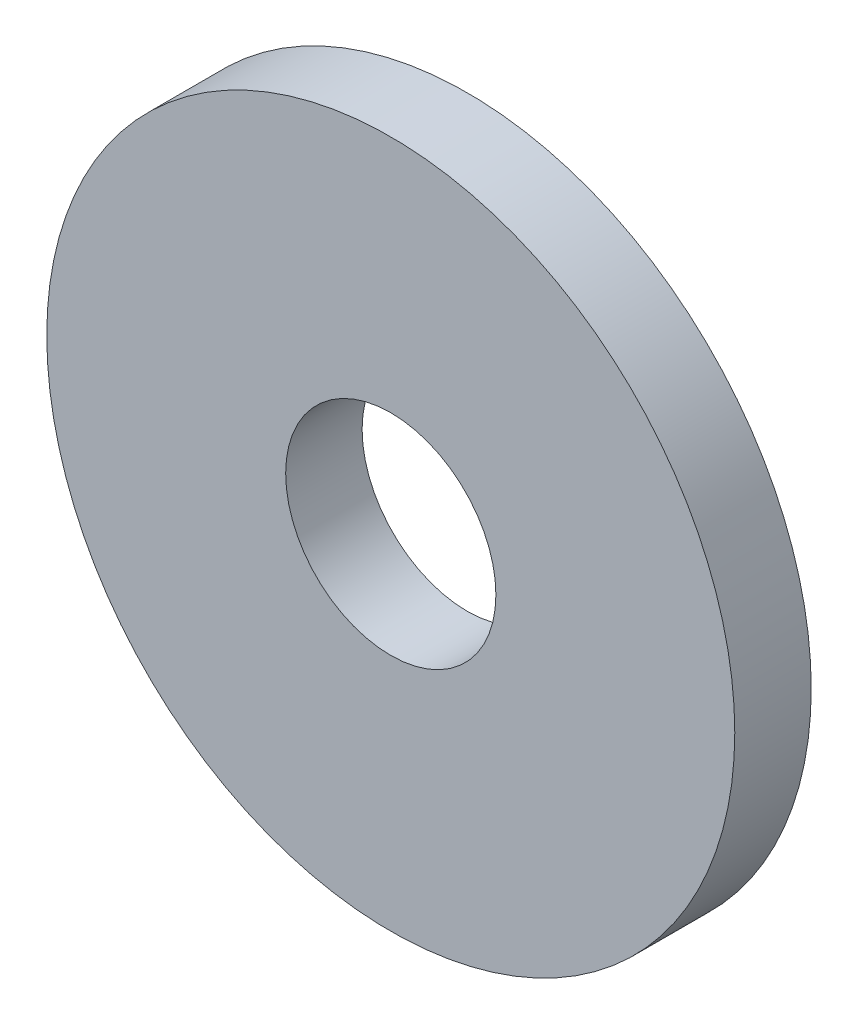
ISO-10303-21;
HEADER;
FILE_DESCRIPTION(('STEP AP214'),'2;1');
FILE_NAME('part.step','',(''),(''),'','','');
FILE_SCHEMA(('AUTOMOTIVE_DESIGN { 1 0 10303 214 1 1 1 1 }'));
ENDSEC;
DATA;
#1=APPLICATION_CONTEXT('core data for automotive mechanical design processes');
#2=APPLICATION_PROTOCOL_DEFINITION('international standard','automotive_design',2000,#1);
#3=PRODUCT_CONTEXT('',#1,'mechanical');
#4=PRODUCT('Part','Part','',(#3));
#5=PRODUCT_RELATED_PRODUCT_CATEGORY('part','',(#4));
#6=PRODUCT_DEFINITION_FORMATION('','',#4);
#7=PRODUCT_DEFINITION_CONTEXT('part definition',#1,'design');
#8=PRODUCT_DEFINITION('design','',#6,#7);
#9=PRODUCT_DEFINITION_SHAPE('','',#8);
#10=(LENGTH_UNIT() NAMED_UNIT(*) SI_UNIT(.MILLI.,.METRE.));
#11=(NAMED_UNIT(*) PLANE_ANGLE_UNIT() SI_UNIT($,.RADIAN.));
#12=(NAMED_UNIT(*) SI_UNIT($,.STERADIAN.) SOLID_ANGLE_UNIT());
#13=UNCERTAINTY_MEASURE_WITH_UNIT(LENGTH_MEASURE(1.E-05),#10,'distance_accuracy_value','');
#14=(GEOMETRIC_REPRESENTATION_CONTEXT(3) GLOBAL_UNCERTAINTY_ASSIGNED_CONTEXT((#13)) GLOBAL_UNIT_ASSIGNED_CONTEXT((#10,
#11,#12)) REPRESENTATION_CONTEXT('',''));
#15=CARTESIAN_POINT('',(0.,0.,0.));
#16=DIRECTION('',(0.,0.,1.));
#17=DIRECTION('',(1.,0.,0.));
#18=AXIS2_PLACEMENT_3D('',#15,#16,#17);
#19=CARTESIAN_POINT('',(1974.69562772419,1141.24178453789,2.));
#20=DIRECTION('',(0.,0.,1.));
#21=DIRECTION('',(1.,0.,0.));
#22=AXIS2_PLACEMENT_3D('',#19,#20,#21);
#23=PLANE('',#22);
#24=CARTESIAN_POINT('',(1974.69562772419,1141.24178453789,2.));
#25=DIRECTION('',(0.,0.,1.));
#26=DIRECTION('',(1.,0.,0.));
#27=AXIS2_PLACEMENT_3D('',#24,#25,#26);
#28=CIRCLE('',#27,8.9999999999999);
#29=CARTESIAN_POINT('',(1983.69562772419,1141.24178453789,2.));
#30=VERTEX_POINT('',#29);
#31=EDGE_CURVE('E10',#30,#30,#28,.T.);
#32=ORIENTED_EDGE('',*,*,#31,.T.);
#33=EDGE_LOOP('',(#32));
#34=FACE_BOUND('',#33,.T.);
#35=CARTESIAN_POINT('',(1974.69562772419,1141.24178453789,2.));
#36=DIRECTION('',(0.,0.,1.));
#37=DIRECTION('',(1.,0.,0.));
#38=AXIS2_PLACEMENT_3D('',#35,#36,#37);
#39=CIRCLE('',#38,2.75000000000003);
#40=CARTESIAN_POINT('',(1977.44562772419,1141.24178453789,2.));
#41=VERTEX_POINT('',#40);
#42=EDGE_CURVE('E41',#41,#41,#39,.T.);
#43=ORIENTED_EDGE('',*,*,#42,.F.);
#44=EDGE_LOOP('',(#43));
#45=FACE_BOUND('',#44,.T.);
#46=ADVANCED_FACE('F30',(#34,#45),#23,.T.);
#47=CARTESIAN_POINT('',(1974.69562772419,1141.24178453789,0.));
#48=DIRECTION('',(0.,0.,1.));
#49=DIRECTION('',(1.,0.,0.));
#50=AXIS2_PLACEMENT_3D('',#47,#48,#49);
#51=PLANE('',#50);
#52=CARTESIAN_POINT('',(1974.69562772419,1141.24178453789,0.));
#53=DIRECTION('',(0.,0.,1.));
#54=DIRECTION('',(1.,0.,0.));
#55=AXIS2_PLACEMENT_3D('',#52,#53,#54);
#56=CIRCLE('',#55,8.9999999999999);
#57=CARTESIAN_POINT('',(1983.69562772419,1141.24178453789,0.));
#58=VERTEX_POINT('',#57);
#59=EDGE_CURVE('E34',#58,#58,#56,.T.);
#60=ORIENTED_EDGE('',*,*,#59,.F.);
#61=EDGE_LOOP('',(#60));
#62=FACE_BOUND('',#61,.T.);
#63=CARTESIAN_POINT('',(1974.69562772419,1141.24178453789,0.));
#64=DIRECTION('',(0.,0.,1.));
#65=DIRECTION('',(1.,0.,0.));
#66=AXIS2_PLACEMENT_3D('',#63,#64,#65);
#67=CIRCLE('',#66,2.75000000000003);
#68=CARTESIAN_POINT('',(1977.44562772419,1141.24178453789,0.));
#69=VERTEX_POINT('',#68);
#70=EDGE_CURVE('E43',#69,#69,#67,.T.);
#71=ORIENTED_EDGE('',*,*,#70,.T.);
#72=EDGE_LOOP('',(#71));
#73=FACE_BOUND('',#72,.T.);
#74=ADVANCED_FACE('F53',(#62,#73),#51,.F.);
#75=CARTESIAN_POINT('',(1974.69562772419,1141.24178453789,2.));
#76=DIRECTION('',(0.,0.,-1.));
#77=DIRECTION('',(-1.,0.,0.));
#78=AXIS2_PLACEMENT_3D('',#75,#76,#77);
#79=CYLINDRICAL_SURFACE('',#78,8.9999999999999);
#80=ORIENTED_EDGE('',*,*,#31,.F.);
#81=EDGE_LOOP('',(#80));
#82=FACE_BOUND('',#81,.T.);
#83=ORIENTED_EDGE('',*,*,#59,.T.);
#84=EDGE_LOOP('',(#83));
#85=FACE_BOUND('',#84,.T.);
#86=ADVANCED_FACE('F32',(#82,#85),#79,.T.);
#87=CARTESIAN_POINT('',(1974.69562772419,1141.24178453789,2.));
#88=DIRECTION('',(0.,0.,-1.));
#89=DIRECTION('',(-1.,0.,0.));
#90=AXIS2_PLACEMENT_3D('',#87,#88,#89);
#91=CYLINDRICAL_SURFACE('',#90,2.75000000000003);
#92=ORIENTED_EDGE('',*,*,#42,.T.);
#93=EDGE_LOOP('',(#92));
#94=FACE_BOUND('',#93,.T.);
#95=ORIENTED_EDGE('',*,*,#70,.F.);
#96=EDGE_LOOP('',(#95));
#97=FACE_BOUND('',#96,.T.);
#98=ADVANCED_FACE('F49',(#94,#97),#91,.F.);
#99=CLOSED_SHELL('',(#46,#74,#86,#98));
#100=MANIFOLD_SOLID_BREP('B2',#99);
#101=ADVANCED_BREP_SHAPE_REPRESENTATION('',(#18,#100),#14);
#102=SHAPE_DEFINITION_REPRESENTATION(#9,#101);
ENDSEC;
END-ISO-10303-21;
